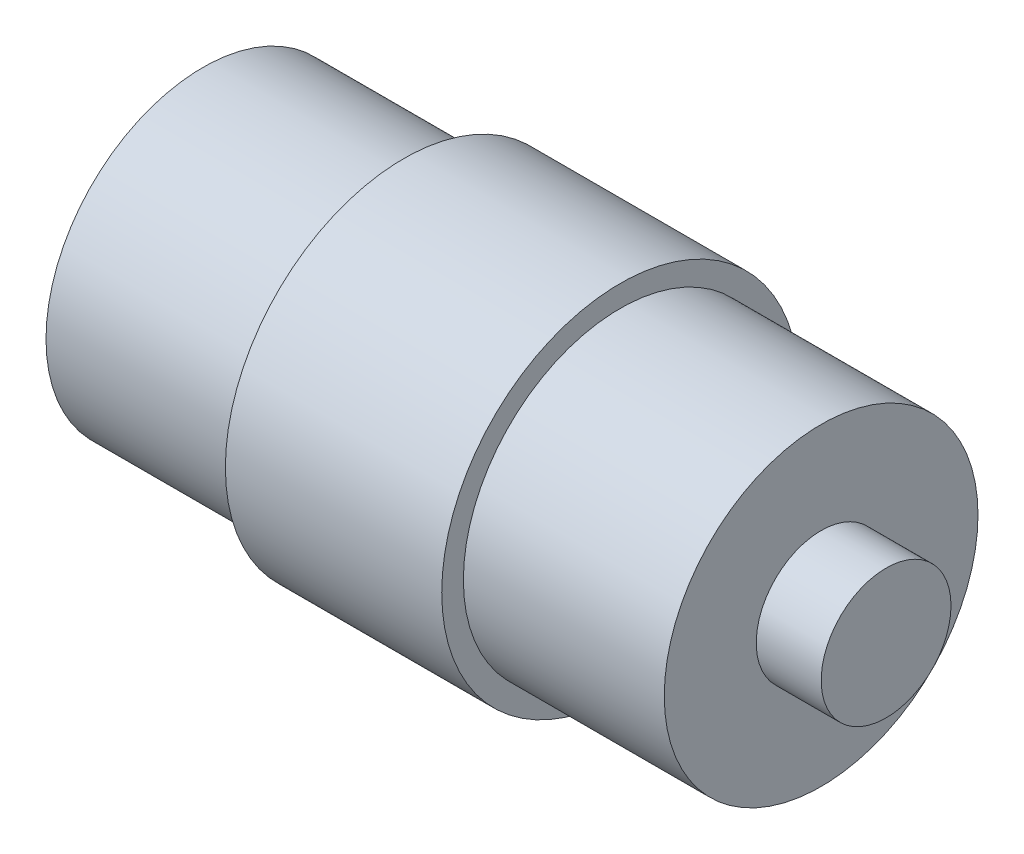
ISO-10303-21;
HEADER;
FILE_DESCRIPTION(('STEP AP214'),'2;1');
FILE_NAME('part.step','',(''),(''),'','','');
FILE_SCHEMA(('AUTOMOTIVE_DESIGN { 1 0 10303 214 1 1 1 1 }'));
ENDSEC;
DATA;
#1=APPLICATION_CONTEXT('core data for automotive mechanical design processes');
#2=APPLICATION_PROTOCOL_DEFINITION('international standard','automotive_design',2000,#1);
#3=PRODUCT_CONTEXT('',#1,'mechanical');
#4=PRODUCT('Part','Part','',(#3));
#5=PRODUCT_RELATED_PRODUCT_CATEGORY('part','',(#4));
#6=PRODUCT_DEFINITION_FORMATION('','',#4);
#7=PRODUCT_DEFINITION_CONTEXT('part definition',#1,'design');
#8=PRODUCT_DEFINITION('design','',#6,#7);
#9=PRODUCT_DEFINITION_SHAPE('','',#8);
#10=(LENGTH_UNIT() NAMED_UNIT(*) SI_UNIT(.MILLI.,.METRE.));
#11=(NAMED_UNIT(*) PLANE_ANGLE_UNIT() SI_UNIT($,.RADIAN.));
#12=(NAMED_UNIT(*) SI_UNIT($,.STERADIAN.) SOLID_ANGLE_UNIT());
#13=UNCERTAINTY_MEASURE_WITH_UNIT(LENGTH_MEASURE(1.E-05),#10,'distance_accuracy_value','');
#14=(GEOMETRIC_REPRESENTATION_CONTEXT(3) GLOBAL_UNCERTAINTY_ASSIGNED_CONTEXT((#13)) GLOBAL_UNIT_ASSIGNED_CONTEXT((#10,
#11,#12)) REPRESENTATION_CONTEXT('',''));
#15=CARTESIAN_POINT('',(0.,0.,0.));
#16=DIRECTION('',(0.,0.,1.));
#17=DIRECTION('',(1.,0.,0.));
#18=AXIS2_PLACEMENT_3D('',#15,#16,#17);
#19=CARTESIAN_POINT('',(28.575,0.,0.));
#20=DIRECTION('',(-1.,0.,0.));
#21=DIRECTION('',(0.,0.,1.));
#22=AXIS2_PLACEMENT_3D('',#19,#20,#21);
#23=CYLINDRICAL_SURFACE('',#22,7.25);
#24=CARTESIAN_POINT('',(0.,0.,0.));
#25=DIRECTION('',(1.,0.,0.));
#26=DIRECTION('',(0.,0.,-1.));
#27=AXIS2_PLACEMENT_3D('',#24,#25,#26);
#28=CIRCLE('',#27,7.25);
#29=CARTESIAN_POINT('',(0.,0.,-7.25));
#30=VERTEX_POINT('',#29);
#31=EDGE_CURVE('E46',#30,#30,#28,.T.);
#32=ORIENTED_EDGE('',*,*,#31,.T.);
#33=EDGE_LOOP('',(#32));
#34=FACE_BOUND('',#33,.T.);
#35=CARTESIAN_POINT('',(9.29,0.,0.));
#36=DIRECTION('',(1.,0.,0.));
#37=DIRECTION('',(0.,0.,-1.));
#38=AXIS2_PLACEMENT_3D('',#35,#36,#37);
#39=CIRCLE('',#38,7.25);
#40=CARTESIAN_POINT('',(9.29,0.,-7.25));
#41=VERTEX_POINT('',#40);
#42=EDGE_CURVE('E38',#41,#41,#39,.T.);
#43=ORIENTED_EDGE('',*,*,#42,.F.);
#44=EDGE_LOOP('',(#43));
#45=FACE_BOUND('',#44,.T.);
#46=ADVANCED_FACE('F31',(#34,#45),#23,.T.);
#47=CARTESIAN_POINT('',(0.,0.,0.));
#48=DIRECTION('',(1.,0.,0.));
#49=DIRECTION('',(0.,0.,-1.));
#50=AXIS2_PLACEMENT_3D('',#47,#48,#49);
#51=PLANE('',#50);
#52=CARTESIAN_POINT('',(0.,0.,0.));
#53=DIRECTION('',(1.,0.,0.));
#54=DIRECTION('',(0.,0.,-1.));
#55=AXIS2_PLACEMENT_3D('',#52,#53,#54);
#56=CIRCLE('',#55,3.);
#57=CARTESIAN_POINT('',(0.,0.,-3.));
#58=VERTEX_POINT('',#57);
#59=EDGE_CURVE('E60',#58,#58,#56,.T.);
#60=ORIENTED_EDGE('',*,*,#59,.T.);
#61=EDGE_LOOP('',(#60));
#62=FACE_BOUND('',#61,.T.);
#63=ORIENTED_EDGE('',*,*,#31,.F.);
#64=EDGE_LOOP('',(#63));
#65=FACE_BOUND('',#64,.T.);
#66=ADVANCED_FACE('F86',(#62,#65),#51,.F.);
#67=CARTESIAN_POINT('',(9.29,0.,0.));
#68=DIRECTION('',(1.,0.,0.));
#69=DIRECTION('',(0.,0.,-1.));
#70=AXIS2_PLACEMENT_3D('',#67,#68,#69);
#71=CYLINDRICAL_SURFACE('',#70,8.25);
#72=CARTESIAN_POINT('',(9.29,0.,0.));
#73=DIRECTION('',(1.,0.,0.));
#74=DIRECTION('',(0.,0.,-1.));
#75=AXIS2_PLACEMENT_3D('',#72,#73,#74);
#76=CIRCLE('',#75,8.25);
#77=CARTESIAN_POINT('',(9.29,0.,-8.25));
#78=VERTEX_POINT('',#77);
#79=EDGE_CURVE('E52',#78,#78,#76,.T.);
#80=ORIENTED_EDGE('',*,*,#79,.T.);
#81=EDGE_LOOP('',(#80));
#82=FACE_BOUND('',#81,.T.);
#83=CARTESIAN_POINT('',(19.29,0.,0.));
#84=DIRECTION('',(1.,0.,0.));
#85=DIRECTION('',(0.,0.,-1.));
#86=AXIS2_PLACEMENT_3D('',#83,#84,#85);
#87=CIRCLE('',#86,8.25);
#88=CARTESIAN_POINT('',(19.29,0.,-8.25));
#89=VERTEX_POINT('',#88);
#90=EDGE_CURVE('E57',#89,#89,#87,.T.);
#91=ORIENTED_EDGE('',*,*,#90,.F.);
#92=EDGE_LOOP('',(#91));
#93=FACE_BOUND('',#92,.T.);
#94=ADVANCED_FACE('F91',(#82,#93),#71,.T.);
#95=CARTESIAN_POINT('',(9.29,0.,0.));
#96=DIRECTION('',(1.,0.,0.));
#97=DIRECTION('',(0.,0.,-1.));
#98=AXIS2_PLACEMENT_3D('',#95,#96,#97);
#99=PLANE('',#98);
#100=ORIENTED_EDGE('',*,*,#42,.T.);
#101=EDGE_LOOP('',(#100));
#102=FACE_BOUND('',#101,.T.);
#103=ORIENTED_EDGE('',*,*,#79,.F.);
#104=EDGE_LOOP('',(#103));
#105=FACE_BOUND('',#104,.T.);
#106=ADVANCED_FACE('F110',(#102,#105),#99,.F.);
#107=CARTESIAN_POINT('',(19.29,0.,0.));
#108=DIRECTION('',(1.,0.,0.));
#109=DIRECTION('',(0.,0.,-1.));
#110=AXIS2_PLACEMENT_3D('',#107,#108,#109);
#111=PLANE('',#110);
#112=CARTESIAN_POINT('',(19.29,0.,0.));
#113=DIRECTION('',(1.,0.,0.));
#114=DIRECTION('',(0.,0.,-1.));
#115=AXIS2_PLACEMENT_3D('',#112,#113,#114);
#116=CIRCLE('',#115,7.25);
#117=CARTESIAN_POINT('',(19.29,0.,-7.25));
#118=VERTEX_POINT('',#117);
#119=EDGE_CURVE('E49',#118,#118,#116,.T.);
#120=ORIENTED_EDGE('',*,*,#119,.F.);
#121=EDGE_LOOP('',(#120));
#122=FACE_BOUND('',#121,.T.);
#123=ORIENTED_EDGE('',*,*,#90,.T.);
#124=EDGE_LOOP('',(#123));
#125=FACE_BOUND('',#124,.T.);
#126=ADVANCED_FACE('F100',(#122,#125),#111,.T.);
#127=CARTESIAN_POINT('',(28.575,0.,0.));
#128=DIRECTION('',(1.,0.,0.));
#129=DIRECTION('',(0.,0.,-1.));
#130=AXIS2_PLACEMENT_3D('',#127,#128,#129);
#131=PLANE('',#130);
#132=CARTESIAN_POINT('',(28.575,0.,0.));
#133=DIRECTION('',(1.,0.,0.));
#134=DIRECTION('',(0.,0.,-1.));
#135=AXIS2_PLACEMENT_3D('',#132,#133,#134);
#136=CIRCLE('',#135,3.);
#137=CARTESIAN_POINT('',(28.575,0.,-3.));
#138=VERTEX_POINT('',#137);
#139=EDGE_CURVE('E10',#138,#138,#136,.T.);
#140=ORIENTED_EDGE('',*,*,#139,.F.);
#141=EDGE_LOOP('',(#140));
#142=FACE_BOUND('',#141,.T.);
#143=CARTESIAN_POINT('',(28.575,0.,0.));
#144=DIRECTION('',(1.,0.,0.));
#145=DIRECTION('',(0.,0.,-1.));
#146=AXIS2_PLACEMENT_3D('',#143,#144,#145);
#147=CIRCLE('',#146,7.25);
#148=CARTESIAN_POINT('',(28.575,0.,-7.25));
#149=VERTEX_POINT('',#148);
#150=EDGE_CURVE('E42',#149,#149,#147,.T.);
#151=ORIENTED_EDGE('',*,*,#150,.T.);
#152=EDGE_LOOP('',(#151));
#153=FACE_BOUND('',#152,.T.);
#154=ADVANCED_FACE('F95',(#142,#153),#131,.T.);
#155=ORIENTED_EDGE('',*,*,#119,.T.);
#156=EDGE_LOOP('',(#155));
#157=FACE_BOUND('',#156,.T.);
#158=ORIENTED_EDGE('',*,*,#150,.F.);
#159=EDGE_LOOP('',(#158));
#160=FACE_BOUND('',#159,.T.);
#161=ADVANCED_FACE('F33',(#157,#160),#23,.T.);
#162=CARTESIAN_POINT('',(31.5775,0.,0.));
#163=DIRECTION('',(1.,0.,0.));
#164=DIRECTION('',(0.,0.,-1.));
#165=AXIS2_PLACEMENT_3D('',#162,#163,#164);
#166=PLANE('',#165);
#167=CARTESIAN_POINT('',(31.5775,0.,0.));
#168=DIRECTION('',(1.,0.,0.));
#169=DIRECTION('',(0.,0.,-1.));
#170=AXIS2_PLACEMENT_3D('',#167,#168,#169);
#171=CIRCLE('',#170,3.);
#172=CARTESIAN_POINT('',(31.5775,0.,-3.));
#173=VERTEX_POINT('',#172);
#174=EDGE_CURVE('E66',#173,#173,#171,.T.);
#175=ORIENTED_EDGE('',*,*,#174,.T.);
#176=EDGE_LOOP('',(#175));
#177=FACE_BOUND('',#176,.T.);
#178=ADVANCED_FACE('F70',(#177),#166,.T.);
#179=CARTESIAN_POINT('',(-2.9975,0.,0.));
#180=DIRECTION('',(1.,0.,0.));
#181=DIRECTION('',(0.,0.,-1.));
#182=AXIS2_PLACEMENT_3D('',#179,#180,#181);
#183=CYLINDRICAL_SURFACE('',#182,3.);
#184=ORIENTED_EDGE('',*,*,#139,.T.);
#185=EDGE_LOOP('',(#184));
#186=FACE_BOUND('',#185,.T.);
#187=ORIENTED_EDGE('',*,*,#174,.F.);
#188=EDGE_LOOP('',(#187));
#189=FACE_BOUND('',#188,.T.);
#190=ADVANCED_FACE('F72',(#186,#189),#183,.T.);
#191=CARTESIAN_POINT('',(-2.9975,0.,0.));
#192=DIRECTION('',(1.,0.,0.));
#193=DIRECTION('',(0.,0.,-1.));
#194=AXIS2_PLACEMENT_3D('',#191,#192,#193);
#195=CIRCLE('',#194,3.);
#196=CARTESIAN_POINT('',(-2.9975,0.,-3.));
#197=VERTEX_POINT('',#196);
#198=EDGE_CURVE('E63',#197,#197,#195,.T.);
#199=ORIENTED_EDGE('',*,*,#198,.T.);
#200=EDGE_LOOP('',(#199));
#201=FACE_BOUND('',#200,.T.);
#202=ORIENTED_EDGE('',*,*,#59,.F.);
#203=EDGE_LOOP('',(#202));
#204=FACE_BOUND('',#203,.T.);
#205=ADVANCED_FACE('F74',(#201,#204),#183,.T.);
#206=CARTESIAN_POINT('',(-2.9975,0.,0.));
#207=DIRECTION('',(1.,0.,0.));
#208=DIRECTION('',(0.,0.,-1.));
#209=AXIS2_PLACEMENT_3D('',#206,#207,#208);
#210=PLANE('',#209);
#211=ORIENTED_EDGE('',*,*,#198,.F.);
#212=EDGE_LOOP('',(#211));
#213=FACE_BOUND('',#212,.T.);
#214=ADVANCED_FACE('F80',(#213),#210,.F.);
#215=CLOSED_SHELL('',(#46,#66,#94,#106,#126,#154,#161,#178,#190,#205,#214));
#216=MANIFOLD_SOLID_BREP('B2',#215);
#217=ADVANCED_BREP_SHAPE_REPRESENTATION('',(#18,#216),#14);
#218=SHAPE_DEFINITION_REPRESENTATION(#9,#217);
ENDSEC;
END-ISO-10303-21;
